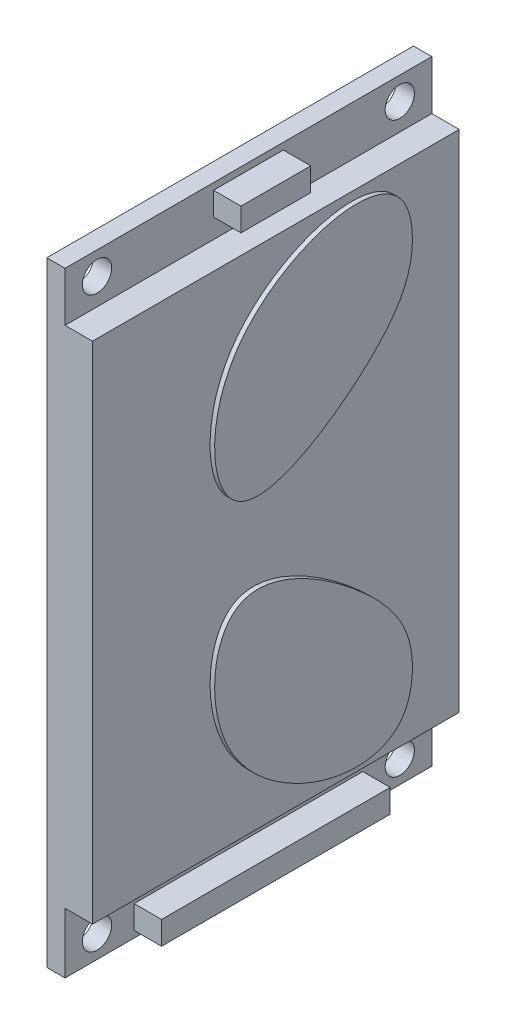
ISO-10303-21;
HEADER;
FILE_DESCRIPTION(('STEP AP214'),'2;1');
FILE_NAME('part.step','',(''),(''),'','','');
FILE_SCHEMA(('AUTOMOTIVE_DESIGN { 1 0 10303 214 1 1 1 1 }'));
ENDSEC;
DATA;
#1=APPLICATION_CONTEXT('core data for automotive mechanical design processes');
#2=APPLICATION_PROTOCOL_DEFINITION('international standard','automotive_design',2000,#1);
#3=PRODUCT_CONTEXT('',#1,'mechanical');
#4=PRODUCT('Part','Part','',(#3));
#5=PRODUCT_RELATED_PRODUCT_CATEGORY('part','',(#4));
#6=PRODUCT_DEFINITION_FORMATION('','',#4);
#7=PRODUCT_DEFINITION_CONTEXT('part definition',#1,'design');
#8=PRODUCT_DEFINITION('design','',#6,#7);
#9=PRODUCT_DEFINITION_SHAPE('','',#8);
#10=(LENGTH_UNIT() NAMED_UNIT(*) SI_UNIT(.MILLI.,.METRE.));
#11=(NAMED_UNIT(*) PLANE_ANGLE_UNIT() SI_UNIT($,.RADIAN.));
#12=(NAMED_UNIT(*) SI_UNIT($,.STERADIAN.) SOLID_ANGLE_UNIT());
#13=UNCERTAINTY_MEASURE_WITH_UNIT(LENGTH_MEASURE(1.E-05),#10,'distance_accuracy_value','');
#14=(GEOMETRIC_REPRESENTATION_CONTEXT(3) GLOBAL_UNCERTAINTY_ASSIGNED_CONTEXT((#13)) GLOBAL_UNIT_ASSIGNED_CONTEXT((#10,
#11,#12)) REPRESENTATION_CONTEXT('',''));
#15=CARTESIAN_POINT('',(0.,0.,0.));
#16=DIRECTION('',(0.,0.,1.));
#17=DIRECTION('',(1.,0.,0.));
#18=AXIS2_PLACEMENT_3D('',#15,#16,#17);
#19=CARTESIAN_POINT('',(5.,0.,0.));
#20=DIRECTION('',(1.,0.,0.));
#21=DIRECTION('',(0.,0.,-1.));
#22=AXIS2_PLACEMENT_3D('',#19,#20,#21);
#23=PLANE('',#22);
#24=CARTESIAN_POINT('',(5.,-10.2586471575167,-9.42816080804507));
#25=CARTESIAN_POINT('',(5.,-6.29072358338968,-5.12400212686618));
#26=CARTESIAN_POINT('',(5.,1.29246768812794,7.12818951407956));
#27=CARTESIAN_POINT('',(5.,-22.7986894668621,8.89477922719525));
#28=CARTESIAN_POINT('',(5.,-29.6711719479845,-13.4149737789119));
#29=CARTESIAN_POINT('',(5.,-16.6006162500444,-15.011746549894));
#30=CARTESIAN_POINT('',(5.,-12.7665080775932,-12.148533604719));
#31=CARTESIAN_POINT('',(5.,-10.2586471575167,-9.42816080804507));
#32=B_SPLINE_CURVE_WITH_KNOTS('',3,(#24,#25,#26,#27,#28,#29,#30,#31),.UNSPECIFIED.,.T.,.F.,(4,1,
1,1,1,4),(0.,0.241211959579483,0.458999961125512,0.766283654105539,0.847545942964001,1.),.UNSPECIFIED.);
#33=CARTESIAN_POINT('',(5.,-10.2586471575167,-9.42816080804507));
#34=VERTEX_POINT('',#33);
#35=EDGE_CURVE('E673',#34,#34,#32,.T.);
#36=ORIENTED_EDGE('',*,*,#35,.F.);
#37=EDGE_LOOP('',(#36));
#38=FACE_BOUND('',#37,.T.);
#39=DIRECTION('',(0.,-1.,0.));
#40=VECTOR('',#39,1.);
#41=CARTESIAN_POINT('',(5.,28.2,20.05));
#42=LINE('',#41,#40);
#43=CARTESIAN_POINT('',(5.,28.2,20.05));
#44=VERTEX_POINT('',#43);
#45=CARTESIAN_POINT('',(5.,-27.,20.05));
#46=VERTEX_POINT('',#45);
#47=EDGE_CURVE('E223',#44,#46,#42,.T.);
#48=ORIENTED_EDGE('',*,*,#47,.T.);
#49=DIRECTION('',(0.,0.,-1.));
#50=VECTOR('',#49,1.);
#51=CARTESIAN_POINT('',(5.,-27.,20.05));
#52=LINE('',#51,#50);
#53=CARTESIAN_POINT('',(5.,-27.,-20.05));
#54=VERTEX_POINT('',#53);
#55=EDGE_CURVE('E226',#46,#54,#52,.T.);
#56=ORIENTED_EDGE('',*,*,#55,.T.);
#57=DIRECTION('',(0.,1.,0.));
#58=VECTOR('',#57,1.);
#59=CARTESIAN_POINT('',(5.,28.2,-20.05));
#60=LINE('',#59,#58);
#61=CARTESIAN_POINT('',(5.,28.2,-20.05));
#62=VERTEX_POINT('',#61);
#63=EDGE_CURVE('E229',#54,#62,#60,.T.);
#64=ORIENTED_EDGE('',*,*,#63,.T.);
#65=DIRECTION('',(0.,0.,1.));
#66=VECTOR('',#65,1.);
#67=CARTESIAN_POINT('',(5.,28.2,20.05));
#68=LINE('',#67,#66);
#69=EDGE_CURVE('E231',#62,#44,#68,.T.);
#70=ORIENTED_EDGE('',*,*,#69,.T.);
#71=EDGE_LOOP('',(#48,#56,#64,#70));
#72=FACE_BOUND('',#71,.T.);
#73=CARTESIAN_POINT('',(5.,11.4586471575167,-9.42816080804507));
#74=CARTESIAN_POINT('',(5.,13.9665080775932,-12.148533604719));
#75=CARTESIAN_POINT('',(5.,17.8006162500443,-15.011746549894));
#76=CARTESIAN_POINT('',(5.,30.8711719479844,-13.4149737789119));
#77=CARTESIAN_POINT('',(5.,23.9986894668621,8.89477922719526));
#78=CARTESIAN_POINT('',(5.,-0.0924676881279725,7.12818951407956));
#79=CARTESIAN_POINT('',(5.,7.49072358338963,-5.12400212686618));
#80=CARTESIAN_POINT('',(5.,11.4586471575167,-9.42816080804507));
#81=B_SPLINE_CURVE_WITH_KNOTS('',3,(#73,#74,#75,#76,#77,#78,#79,#80),.UNSPECIFIED.,.T.,.F.,(4,1,
1,1,1,4),(0.,0.152454057035999,0.233716345894461,0.541000038874488,0.758788040420517,1.),.UNSPECIFIED.);
#82=CARTESIAN_POINT('',(5.,11.4586471575167,-9.42816080804507));
#83=VERTEX_POINT('',#82);
#84=EDGE_CURVE('E686',#83,#83,#81,.T.);
#85=ORIENTED_EDGE('',*,*,#84,.F.);
#86=EDGE_LOOP('',(#85));
#87=FACE_BOUND('',#86,.T.);
#88=ADVANCED_FACE('F45',(#38,#72,#87),#23,.T.);
#89=CARTESIAN_POINT('',(2.,0.,0.));
#90=DIRECTION('',(-1.,0.,0.));
#91=DIRECTION('',(0.,0.,1.));
#92=AXIS2_PLACEMENT_3D('',#89,#90,#91);
#93=PLANE('',#92);
#94=DIRECTION('',(0.,0.,1.));
#95=VECTOR('',#94,1.);
#96=CARTESIAN_POINT('',(2.,28.2,20.05));
#97=LINE('',#96,#95);
#98=CARTESIAN_POINT('',(2.,28.2,-20.05));
#99=VERTEX_POINT('',#98);
#100=CARTESIAN_POINT('',(2.,28.2,20.05));
#101=VERTEX_POINT('',#100);
#102=EDGE_CURVE('E227',#99,#101,#97,.T.);
#103=ORIENTED_EDGE('',*,*,#102,.F.);
#104=DIRECTION('',(0.,1.,0.));
#105=VECTOR('',#104,1.);
#106=CARTESIAN_POINT('',(2.,-33.6,-20.05));
#107=LINE('',#106,#105);
#108=CARTESIAN_POINT('',(2.,33.6,-20.05));
#109=VERTEX_POINT('',#108);
#110=EDGE_CURVE('E277',#99,#109,#107,.T.);
#111=ORIENTED_EDGE('',*,*,#110,.T.);
#112=DIRECTION('',(0.,0.,1.));
#113=VECTOR('',#112,1.);
#114=CARTESIAN_POINT('',(2.,33.6,20.05));
#115=LINE('',#114,#113);
#116=CARTESIAN_POINT('',(2.,33.6,20.05));
#117=VERTEX_POINT('',#116);
#118=EDGE_CURVE('E276',#109,#117,#115,.T.);
#119=ORIENTED_EDGE('',*,*,#118,.T.);
#120=DIRECTION('',(0.,-1.,0.));
#121=VECTOR('',#120,1.);
#122=CARTESIAN_POINT('',(2.,-33.6,20.05));
#123=LINE('',#122,#121);
#124=EDGE_CURVE('E280',#117,#101,#123,.T.);
#125=ORIENTED_EDGE('',*,*,#124,.T.);
#126=EDGE_LOOP('',(#103,#111,#119,#125));
#127=FACE_BOUND('',#126,.T.);
#128=CARTESIAN_POINT('',(2.,31.1,-16.55));
#129=DIRECTION('',(1.,0.,0.));
#130=DIRECTION('',(0.,0.,-1.));
#131=AXIS2_PLACEMENT_3D('',#128,#129,#130);
#132=CIRCLE('',#131,1.6);
#133=CARTESIAN_POINT('',(2.,31.1,-18.15));
#134=VERTEX_POINT('',#133);
#135=EDGE_CURVE('E268',#134,#134,#132,.T.);
#136=ORIENTED_EDGE('',*,*,#135,.F.);
#137=EDGE_LOOP('',(#136));
#138=FACE_BOUND('',#137,.T.);
#139=CARTESIAN_POINT('',(2.,31.1,16.55));
#140=DIRECTION('',(1.,0.,0.));
#141=DIRECTION('',(0.,0.,1.));
#142=AXIS2_PLACEMENT_3D('',#139,#140,#141);
#143=CIRCLE('',#142,1.6);
#144=CARTESIAN_POINT('',(2.,31.1,18.15));
#145=VERTEX_POINT('',#144);
#146=EDGE_CURVE('E250',#145,#145,#143,.T.);
#147=ORIENTED_EDGE('',*,*,#146,.F.);
#148=EDGE_LOOP('',(#147));
#149=FACE_BOUND('',#148,.T.);
#150=DIRECTION('',(0.,-1.,0.));
#151=VECTOR('',#150,1.);
#152=CARTESIAN_POINT('',(2.,32.87,3.81));
#153=LINE('',#152,#151);
#154=CARTESIAN_POINT('',(2.,32.87,3.81));
#155=VERTEX_POINT('',#154);
#156=CARTESIAN_POINT('',(2.,30.33,3.81));
#157=VERTEX_POINT('',#156);
#158=EDGE_CURVE('E154',#155,#157,#153,.T.);
#159=ORIENTED_EDGE('',*,*,#158,.F.);
#160=DIRECTION('',(0.,0.,1.));
#161=VECTOR('',#160,1.);
#162=CARTESIAN_POINT('',(2.,32.87,3.81));
#163=LINE('',#162,#161);
#164=CARTESIAN_POINT('',(2.,32.87,-3.81));
#165=VERTEX_POINT('',#164);
#166=EDGE_CURVE('E157',#165,#155,#163,.T.);
#167=ORIENTED_EDGE('',*,*,#166,.F.);
#168=DIRECTION('',(0.,1.,0.));
#169=VECTOR('',#168,1.);
#170=CARTESIAN_POINT('',(2.,32.87,-3.81));
#171=LINE('',#170,#169);
#172=CARTESIAN_POINT('',(2.,30.33,-3.81));
#173=VERTEX_POINT('',#172);
#174=EDGE_CURVE('E65',#173,#165,#171,.T.);
#175=ORIENTED_EDGE('',*,*,#174,.F.);
#176=DIRECTION('',(0.,0.,-1.));
#177=VECTOR('',#176,1.);
#178=CARTESIAN_POINT('',(2.,30.33,3.81));
#179=LINE('',#178,#177);
#180=EDGE_CURVE('E60',#157,#173,#179,.T.);
#181=ORIENTED_EDGE('',*,*,#180,.F.);
#182=EDGE_LOOP('',(#159,#167,#175,#181));
#183=FACE_BOUND('',#182,.T.);
#184=ADVANCED_FACE('F156',(#127,#138,#149,#183),#93,.F.);
#185=DIRECTION('',(0.,0.,-1.));
#186=VECTOR('',#185,1.);
#187=CARTESIAN_POINT('',(2.,-27.,20.05));
#188=LINE('',#187,#186);
#189=CARTESIAN_POINT('',(2.,-27.,20.05));
#190=VERTEX_POINT('',#189);
#191=CARTESIAN_POINT('',(2.,-27.,-20.05));
#192=VERTEX_POINT('',#191);
#193=EDGE_CURVE('E215',#190,#192,#188,.T.);
#194=ORIENTED_EDGE('',*,*,#193,.F.);
#195=CARTESIAN_POINT('',(2.,-33.6,20.05));
#196=VERTEX_POINT('',#195);
#197=EDGE_CURVE('E279',#190,#196,#123,.T.);
#198=ORIENTED_EDGE('',*,*,#197,.T.);
#199=DIRECTION('',(0.,0.,-1.));
#200=VECTOR('',#199,1.);
#201=CARTESIAN_POINT('',(2.,-33.6,20.05));
#202=LINE('',#201,#200);
#203=CARTESIAN_POINT('',(2.,-33.6,-20.05));
#204=VERTEX_POINT('',#203);
#205=EDGE_CURVE('E282',#196,#204,#202,.T.);
#206=ORIENTED_EDGE('',*,*,#205,.T.);
#207=EDGE_CURVE('E274',#204,#192,#107,.T.);
#208=ORIENTED_EDGE('',*,*,#207,.T.);
#209=EDGE_LOOP('',(#194,#198,#206,#208));
#210=FACE_BOUND('',#209,.T.);
#211=CARTESIAN_POINT('',(2.,-31.11,-16.55));
#212=DIRECTION('',(1.,0.,0.));
#213=DIRECTION('',(0.,0.,-1.));
#214=AXIS2_PLACEMENT_3D('',#211,#212,#213);
#215=CIRCLE('',#214,1.6);
#216=CARTESIAN_POINT('',(2.,-31.11,-18.15));
#217=VERTEX_POINT('',#216);
#218=EDGE_CURVE('E262',#217,#217,#215,.T.);
#219=ORIENTED_EDGE('',*,*,#218,.F.);
#220=EDGE_LOOP('',(#219));
#221=FACE_BOUND('',#220,.T.);
#222=CARTESIAN_POINT('',(2.,-31.11,16.55));
#223=DIRECTION('',(1.,0.,0.));
#224=DIRECTION('',(0.,0.,1.));
#225=AXIS2_PLACEMENT_3D('',#222,#223,#224);
#226=CIRCLE('',#225,1.6);
#227=CARTESIAN_POINT('',(2.,-31.11,18.15));
#228=VERTEX_POINT('',#227);
#229=EDGE_CURVE('E256',#228,#228,#226,.T.);
#230=ORIENTED_EDGE('',*,*,#229,.F.);
#231=EDGE_LOOP('',(#230));
#232=FACE_BOUND('',#231,.T.);
#233=DIRECTION('',(0.,-1.,0.));
#234=VECTOR('',#233,1.);
#235=CARTESIAN_POINT('',(2.,-30.33,12.5));
#236=LINE('',#235,#234);
#237=CARTESIAN_POINT('',(2.,-30.33,12.5));
#238=VERTEX_POINT('',#237);
#239=CARTESIAN_POINT('',(2.,-32.87,12.5));
#240=VERTEX_POINT('',#239);
#241=EDGE_CURVE('E212',#238,#240,#236,.T.);
#242=ORIENTED_EDGE('',*,*,#241,.F.);
#243=DIRECTION('',(0.,0.,1.));
#244=VECTOR('',#243,1.);
#245=CARTESIAN_POINT('',(2.,-30.33,12.5));
#246=LINE('',#245,#244);
#247=CARTESIAN_POINT('',(2.,-30.33,-12.5));
#248=VERTEX_POINT('',#247);
#249=EDGE_CURVE('E202',#248,#238,#246,.T.);
#250=ORIENTED_EDGE('',*,*,#249,.F.);
#251=DIRECTION('',(0.,1.,0.));
#252=VECTOR('',#251,1.);
#253=CARTESIAN_POINT('',(2.,-30.33,-12.5));
#254=LINE('',#253,#252);
#255=CARTESIAN_POINT('',(2.,-32.87,-12.5));
#256=VERTEX_POINT('',#255);
#257=EDGE_CURVE('E205',#256,#248,#254,.T.);
#258=ORIENTED_EDGE('',*,*,#257,.F.);
#259=DIRECTION('',(0.,0.,-1.));
#260=VECTOR('',#259,1.);
#261=CARTESIAN_POINT('',(2.,-32.87,12.5));
#262=LINE('',#261,#260);
#263=EDGE_CURVE('E209',#240,#256,#262,.T.);
#264=ORIENTED_EDGE('',*,*,#263,.F.);
#265=EDGE_LOOP('',(#242,#250,#258,#264));
#266=FACE_BOUND('',#265,.T.);
#267=ADVANCED_FACE('F321',(#210,#221,#232,#266),#93,.F.);
#268=CARTESIAN_POINT('',(0.,0.,0.));
#269=DIRECTION('',(-1.,0.,0.));
#270=DIRECTION('',(0.,0.,1.));
#271=AXIS2_PLACEMENT_3D('',#268,#269,#270);
#272=PLANE('',#271);
#273=CARTESIAN_POINT('',(0.,-31.11,16.55));
#274=DIRECTION('',(1.,0.,0.));
#275=DIRECTION('',(0.,0.,1.));
#276=AXIS2_PLACEMENT_3D('',#273,#274,#275);
#277=CIRCLE('',#276,1.6);
#278=CARTESIAN_POINT('',(0.,-31.11,18.15));
#279=VERTEX_POINT('',#278);
#280=EDGE_CURVE('E253',#279,#279,#277,.T.);
#281=ORIENTED_EDGE('',*,*,#280,.T.);
#282=EDGE_LOOP('',(#281));
#283=FACE_BOUND('',#282,.T.);
#284=CARTESIAN_POINT('',(0.,31.1,-16.55));
#285=DIRECTION('',(1.,0.,0.));
#286=DIRECTION('',(0.,0.,-1.));
#287=AXIS2_PLACEMENT_3D('',#284,#285,#286);
#288=CIRCLE('',#287,1.6);
#289=CARTESIAN_POINT('',(0.,31.1,-18.15));
#290=VERTEX_POINT('',#289);
#291=EDGE_CURVE('E265',#290,#290,#288,.T.);
#292=ORIENTED_EDGE('',*,*,#291,.T.);
#293=EDGE_LOOP('',(#292));
#294=FACE_BOUND('',#293,.T.);
#295=DIRECTION('',(0.,1.,0.));
#296=VECTOR('',#295,1.);
#297=CARTESIAN_POINT('',(0.,-33.6,-20.05));
#298=LINE('',#297,#296);
#299=CARTESIAN_POINT('',(0.,-33.6,-20.05));
#300=VERTEX_POINT('',#299);
#301=CARTESIAN_POINT('',(0.,33.6,-20.05));
#302=VERTEX_POINT('',#301);
#303=EDGE_CURVE('E271',#300,#302,#298,.T.);
#304=ORIENTED_EDGE('',*,*,#303,.F.);
#305=DIRECTION('',(0.,0.,-1.));
#306=VECTOR('',#305,1.);
#307=CARTESIAN_POINT('',(0.,-33.6,20.05));
#308=LINE('',#307,#306);
#309=CARTESIAN_POINT('',(0.,-33.6,20.05));
#310=VERTEX_POINT('',#309);
#311=EDGE_CURVE('E291',#310,#300,#308,.T.);
#312=ORIENTED_EDGE('',*,*,#311,.F.);
#313=DIRECTION('',(0.,-1.,0.));
#314=VECTOR('',#313,1.);
#315=CARTESIAN_POINT('',(0.,-33.6,20.05));
#316=LINE('',#315,#314);
#317=CARTESIAN_POINT('',(0.,33.6,20.05));
#318=VERTEX_POINT('',#317);
#319=EDGE_CURVE('E289',#318,#310,#316,.T.);
#320=ORIENTED_EDGE('',*,*,#319,.F.);
#321=DIRECTION('',(0.,0.,1.));
#322=VECTOR('',#321,1.);
#323=CARTESIAN_POINT('',(0.,33.6,20.05));
#324=LINE('',#323,#322);
#325=EDGE_CURVE('E287',#302,#318,#324,.T.);
#326=ORIENTED_EDGE('',*,*,#325,.F.);
#327=EDGE_LOOP('',(#304,#312,#320,#326));
#328=FACE_BOUND('',#327,.T.);
#329=CARTESIAN_POINT('',(0.,-31.11,-16.55));
#330=DIRECTION('',(1.,0.,0.));
#331=DIRECTION('',(0.,0.,-1.));
#332=AXIS2_PLACEMENT_3D('',#329,#330,#331);
#333=CIRCLE('',#332,1.6);
#334=CARTESIAN_POINT('',(0.,-31.11,-18.15));
#335=VERTEX_POINT('',#334);
#336=EDGE_CURVE('E259',#335,#335,#333,.T.);
#337=ORIENTED_EDGE('',*,*,#336,.T.);
#338=EDGE_LOOP('',(#337));
#339=FACE_BOUND('',#338,.T.);
#340=CARTESIAN_POINT('',(0.,31.1,16.55));
#341=DIRECTION('',(1.,0.,0.));
#342=DIRECTION('',(0.,0.,1.));
#343=AXIS2_PLACEMENT_3D('',#340,#341,#342);
#344=CIRCLE('',#343,1.6);
#345=CARTESIAN_POINT('',(0.,31.1,18.15));
#346=VERTEX_POINT('',#345);
#347=EDGE_CURVE('E249',#346,#346,#344,.T.);
#348=ORIENTED_EDGE('',*,*,#347,.T.);
#349=EDGE_LOOP('',(#348));
#350=FACE_BOUND('',#349,.T.);
#351=ADVANCED_FACE('F309',(#283,#294,#328,#339,#350),#272,.T.);
#352=CARTESIAN_POINT('',(2.,-33.6,-20.05));
#353=DIRECTION('',(0.,0.,1.));
#354=DIRECTION('',(1.,0.,0.));
#355=AXIS2_PLACEMENT_3D('',#352,#353,#354);
#356=PLANE('',#355);
#357=ORIENTED_EDGE('',*,*,#303,.T.);
#358=DIRECTION('',(-1.,0.,0.));
#359=VECTOR('',#358,1.);
#360=CARTESIAN_POINT('',(2.,33.6,-20.05));
#361=LINE('',#360,#359);
#362=EDGE_CURVE('E11',#109,#302,#361,.T.);
#363=ORIENTED_EDGE('',*,*,#362,.F.);
#364=ORIENTED_EDGE('',*,*,#110,.F.);
#365=DIRECTION('',(-1.,0.,0.));
#366=VECTOR('',#365,1.);
#367=CARTESIAN_POINT('',(5.,28.2,-20.05));
#368=LINE('',#367,#366);
#369=EDGE_CURVE('E240',#62,#99,#368,.T.);
#370=ORIENTED_EDGE('',*,*,#369,.F.);
#371=ORIENTED_EDGE('',*,*,#63,.F.);
#372=DIRECTION('',(-1.,0.,0.));
#373=VECTOR('',#372,1.);
#374=CARTESIAN_POINT('',(5.,-27.,-20.05));
#375=LINE('',#374,#373);
#376=EDGE_CURVE('E243',#54,#192,#375,.T.);
#377=ORIENTED_EDGE('',*,*,#376,.T.);
#378=ORIENTED_EDGE('',*,*,#207,.F.);
#379=DIRECTION('',(-1.,0.,0.));
#380=VECTOR('',#379,1.);
#381=CARTESIAN_POINT('',(2.,-33.6,-20.05));
#382=LINE('',#381,#380);
#383=EDGE_CURVE('E284',#204,#300,#382,.T.);
#384=ORIENTED_EDGE('',*,*,#383,.T.);
#385=EDGE_LOOP('',(#357,#363,#364,#370,#371,#377,#378,#384));
#386=FACE_BOUND('',#385,.T.);
#387=ADVANCED_FACE('F47',(#386),#356,.F.);
#388=CARTESIAN_POINT('',(2.,33.6,20.05));
#389=DIRECTION('',(0.,-1.,0.));
#390=DIRECTION('',(0.,0.,-1.));
#391=AXIS2_PLACEMENT_3D('',#388,#389,#390);
#392=PLANE('',#391);
#393=ORIENTED_EDGE('',*,*,#325,.T.);
#394=DIRECTION('',(-1.,0.,0.));
#395=VECTOR('',#394,1.);
#396=CARTESIAN_POINT('',(2.,33.6,20.05));
#397=LINE('',#396,#395);
#398=EDGE_CURVE('E53',#117,#318,#397,.T.);
#399=ORIENTED_EDGE('',*,*,#398,.F.);
#400=ORIENTED_EDGE('',*,*,#118,.F.);
#401=ORIENTED_EDGE('',*,*,#362,.T.);
#402=EDGE_LOOP('',(#393,#399,#400,#401));
#403=FACE_BOUND('',#402,.T.);
#404=ADVANCED_FACE('F338',(#403),#392,.F.);
#405=CARTESIAN_POINT('',(2.,-33.6,20.05));
#406=DIRECTION('',(0.,0.,-1.));
#407=DIRECTION('',(0.,1.,0.));
#408=AXIS2_PLACEMENT_3D('',#405,#406,#407);
#409=PLANE('',#408);
#410=ORIENTED_EDGE('',*,*,#319,.T.);
#411=DIRECTION('',(-1.,0.,0.));
#412=VECTOR('',#411,1.);
#413=CARTESIAN_POINT('',(2.,-33.6,20.05));
#414=LINE('',#413,#412);
#415=EDGE_CURVE('E295',#196,#310,#414,.T.);
#416=ORIENTED_EDGE('',*,*,#415,.F.);
#417=ORIENTED_EDGE('',*,*,#197,.F.);
#418=DIRECTION('',(-1.,0.,0.));
#419=VECTOR('',#418,1.);
#420=CARTESIAN_POINT('',(5.,-27.,20.05));
#421=LINE('',#420,#419);
#422=EDGE_CURVE('E246',#46,#190,#421,.T.);
#423=ORIENTED_EDGE('',*,*,#422,.F.);
#424=ORIENTED_EDGE('',*,*,#47,.F.);
#425=DIRECTION('',(-1.,0.,0.));
#426=VECTOR('',#425,1.);
#427=CARTESIAN_POINT('',(5.,28.2,20.05));
#428=LINE('',#427,#426);
#429=EDGE_CURVE('E233',#44,#101,#428,.T.);
#430=ORIENTED_EDGE('',*,*,#429,.T.);
#431=ORIENTED_EDGE('',*,*,#124,.F.);
#432=ORIENTED_EDGE('',*,*,#398,.T.);
#433=EDGE_LOOP('',(#410,#416,#417,#423,#424,#430,#431,#432));
#434=FACE_BOUND('',#433,.T.);
#435=ADVANCED_FACE('F302',(#434),#409,.F.);
#436=CARTESIAN_POINT('',(2.,-33.6,20.05));
#437=DIRECTION('',(0.,1.,0.));
#438=DIRECTION('',(0.,0.,1.));
#439=AXIS2_PLACEMENT_3D('',#436,#437,#438);
#440=PLANE('',#439);
#441=ORIENTED_EDGE('',*,*,#311,.T.);
#442=ORIENTED_EDGE('',*,*,#383,.F.);
#443=ORIENTED_EDGE('',*,*,#205,.F.);
#444=ORIENTED_EDGE('',*,*,#415,.T.);
#445=EDGE_LOOP('',(#441,#442,#443,#444));
#446=FACE_BOUND('',#445,.T.);
#447=ADVANCED_FACE('F313',(#446),#440,.F.);
#448=CARTESIAN_POINT('',(2.,31.1,-16.55));
#449=DIRECTION('',(-1.,0.,0.));
#450=DIRECTION('',(0.,0.,1.));
#451=AXIS2_PLACEMENT_3D('',#448,#449,#450);
#452=CYLINDRICAL_SURFACE('',#451,1.6);
#453=ORIENTED_EDGE('',*,*,#135,.T.);
#454=EDGE_LOOP('',(#453));
#455=FACE_BOUND('',#454,.T.);
#456=ORIENTED_EDGE('',*,*,#291,.F.);
#457=EDGE_LOOP('',(#456));
#458=FACE_BOUND('',#457,.T.);
#459=ADVANCED_FACE('F373',(#455,#458),#452,.F.);
#460=CARTESIAN_POINT('',(2.,-31.11,-16.55));
#461=DIRECTION('',(-1.,0.,0.));
#462=DIRECTION('',(0.,0.,1.));
#463=AXIS2_PLACEMENT_3D('',#460,#461,#462);
#464=CYLINDRICAL_SURFACE('',#463,1.6);
#465=ORIENTED_EDGE('',*,*,#218,.T.);
#466=EDGE_LOOP('',(#465));
#467=FACE_BOUND('',#466,.T.);
#468=ORIENTED_EDGE('',*,*,#336,.F.);
#469=EDGE_LOOP('',(#468));
#470=FACE_BOUND('',#469,.T.);
#471=ADVANCED_FACE('F369',(#467,#470),#464,.F.);
#472=CARTESIAN_POINT('',(2.,-31.11,16.55));
#473=DIRECTION('',(-1.,0.,0.));
#474=DIRECTION('',(0.,0.,1.));
#475=AXIS2_PLACEMENT_3D('',#472,#473,#474);
#476=CYLINDRICAL_SURFACE('',#475,1.6);
#477=ORIENTED_EDGE('',*,*,#229,.T.);
#478=EDGE_LOOP('',(#477));
#479=FACE_BOUND('',#478,.T.);
#480=ORIENTED_EDGE('',*,*,#280,.F.);
#481=EDGE_LOOP('',(#480));
#482=FACE_BOUND('',#481,.T.);
#483=ADVANCED_FACE('F365',(#479,#482),#476,.F.);
#484=CARTESIAN_POINT('',(2.,31.1,16.55));
#485=DIRECTION('',(-1.,0.,0.));
#486=DIRECTION('',(0.,0.,1.));
#487=AXIS2_PLACEMENT_3D('',#484,#485,#486);
#488=CYLINDRICAL_SURFACE('',#487,1.6);
#489=ORIENTED_EDGE('',*,*,#146,.T.);
#490=EDGE_LOOP('',(#489));
#491=FACE_BOUND('',#490,.T.);
#492=ORIENTED_EDGE('',*,*,#347,.F.);
#493=EDGE_LOOP('',(#492));
#494=FACE_BOUND('',#493,.T.);
#495=ADVANCED_FACE('F362',(#491,#494),#488,.F.);
#496=CARTESIAN_POINT('',(5.,-27.,20.05));
#497=DIRECTION('',(0.,1.,0.));
#498=DIRECTION('',(0.,0.,1.));
#499=AXIS2_PLACEMENT_3D('',#496,#497,#498);
#500=PLANE('',#499);
#501=ORIENTED_EDGE('',*,*,#193,.T.);
#502=ORIENTED_EDGE('',*,*,#376,.F.);
#503=ORIENTED_EDGE('',*,*,#55,.F.);
#504=ORIENTED_EDGE('',*,*,#422,.T.);
#505=EDGE_LOOP('',(#501,#502,#503,#504));
#506=FACE_BOUND('',#505,.T.);
#507=ADVANCED_FACE('F325',(#506),#500,.F.);
#508=CARTESIAN_POINT('',(5.,28.2,20.05));
#509=DIRECTION('',(0.,-1.,0.));
#510=DIRECTION('',(0.,0.,-1.));
#511=AXIS2_PLACEMENT_3D('',#508,#509,#510);
#512=PLANE('',#511);
#513=ORIENTED_EDGE('',*,*,#102,.T.);
#514=ORIENTED_EDGE('',*,*,#429,.F.);
#515=ORIENTED_EDGE('',*,*,#69,.F.);
#516=ORIENTED_EDGE('',*,*,#369,.T.);
#517=EDGE_LOOP('',(#513,#514,#515,#516));
#518=FACE_BOUND('',#517,.T.);
#519=ADVANCED_FACE('F334',(#518),#512,.F.);
#520=CARTESIAN_POINT('',(5.,-30.33,12.5));
#521=DIRECTION('',(0.,0.,-1.));
#522=DIRECTION('',(-1.,0.,0.));
#523=AXIS2_PLACEMENT_3D('',#520,#521,#522);
#524=PLANE('',#523);
#525=ORIENTED_EDGE('',*,*,#241,.T.);
#526=DIRECTION('',(-1.,0.,0.));
#527=VECTOR('',#526,1.);
#528=CARTESIAN_POINT('',(5.,-32.87,12.5));
#529=LINE('',#528,#527);
#530=CARTESIAN_POINT('',(5.,-32.87,12.5));
#531=VERTEX_POINT('',#530);
#532=EDGE_CURVE('E161',#531,#240,#529,.T.);
#533=ORIENTED_EDGE('',*,*,#532,.F.);
#534=DIRECTION('',(0.,-1.,0.));
#535=VECTOR('',#534,1.);
#536=CARTESIAN_POINT('',(5.,-30.33,12.5));
#537=LINE('',#536,#535);
#538=CARTESIAN_POINT('',(5.,-30.33,12.5));
#539=VERTEX_POINT('',#538);
#540=EDGE_CURVE('E206',#539,#531,#537,.T.);
#541=ORIENTED_EDGE('',*,*,#540,.F.);
#542=DIRECTION('',(-1.,0.,0.));
#543=VECTOR('',#542,1.);
#544=CARTESIAN_POINT('',(5.,-30.33,12.5));
#545=LINE('',#544,#543);
#546=EDGE_CURVE('E198',#539,#238,#545,.T.);
#547=ORIENTED_EDGE('',*,*,#546,.T.);
#548=EDGE_LOOP('',(#525,#533,#541,#547));
#549=FACE_BOUND('',#548,.T.);
#550=ADVANCED_FACE('F359',(#549),#524,.F.);
#551=CARTESIAN_POINT('',(5.,-32.87,12.5));
#552=DIRECTION('',(0.,1.,0.));
#553=DIRECTION('',(0.,0.,1.));
#554=AXIS2_PLACEMENT_3D('',#551,#552,#553);
#555=PLANE('',#554);
#556=ORIENTED_EDGE('',*,*,#263,.T.);
#557=DIRECTION('',(-1.,0.,0.));
#558=VECTOR('',#557,1.);
#559=CARTESIAN_POINT('',(5.,-32.87,-12.5));
#560=LINE('',#559,#558);
#561=CARTESIAN_POINT('',(5.,-32.87,-12.5));
#562=VERTEX_POINT('',#561);
#563=EDGE_CURVE('E192',#562,#256,#560,.T.);
#564=ORIENTED_EDGE('',*,*,#563,.F.);
#565=DIRECTION('',(0.,0.,-1.));
#566=VECTOR('',#565,1.);
#567=CARTESIAN_POINT('',(5.,-32.87,12.5));
#568=LINE('',#567,#566);
#569=EDGE_CURVE('E219',#531,#562,#568,.T.);
#570=ORIENTED_EDGE('',*,*,#569,.F.);
#571=ORIENTED_EDGE('',*,*,#532,.T.);
#572=EDGE_LOOP('',(#556,#564,#570,#571));
#573=FACE_BOUND('',#572,.T.);
#574=ADVANCED_FACE('F557',(#573),#555,.F.);
#575=CARTESIAN_POINT('',(5.,-30.33,-12.5));
#576=DIRECTION('',(0.,0.,1.));
#577=DIRECTION('',(1.,0.,0.));
#578=AXIS2_PLACEMENT_3D('',#575,#576,#577);
#579=PLANE('',#578);
#580=ORIENTED_EDGE('',*,*,#257,.T.);
#581=DIRECTION('',(-1.,0.,0.));
#582=VECTOR('',#581,1.);
#583=CARTESIAN_POINT('',(5.,-30.33,-12.5));
#584=LINE('',#583,#582);
#585=CARTESIAN_POINT('',(5.,-30.33,-12.5));
#586=VERTEX_POINT('',#585);
#587=EDGE_CURVE('E195',#586,#248,#584,.T.);
#588=ORIENTED_EDGE('',*,*,#587,.F.);
#589=DIRECTION('',(0.,1.,0.));
#590=VECTOR('',#589,1.);
#591=CARTESIAN_POINT('',(5.,-30.33,-12.5));
#592=LINE('',#591,#590);
#593=EDGE_CURVE('E217',#562,#586,#592,.T.);
#594=ORIENTED_EDGE('',*,*,#593,.F.);
#595=ORIENTED_EDGE('',*,*,#563,.T.);
#596=EDGE_LOOP('',(#580,#588,#594,#595));
#597=FACE_BOUND('',#596,.T.);
#598=ADVANCED_FACE('F566',(#597),#579,.F.);
#599=CARTESIAN_POINT('',(5.,-30.33,12.5));
#600=DIRECTION('',(0.,-1.,0.));
#601=DIRECTION('',(0.,0.,-1.));
#602=AXIS2_PLACEMENT_3D('',#599,#600,#601);
#603=PLANE('',#602);
#604=ORIENTED_EDGE('',*,*,#249,.T.);
#605=ORIENTED_EDGE('',*,*,#546,.F.);
#606=DIRECTION('',(0.,0.,1.));
#607=VECTOR('',#606,1.);
#608=CARTESIAN_POINT('',(5.,-30.33,12.5));
#609=LINE('',#608,#607);
#610=EDGE_CURVE('E201',#586,#539,#609,.T.);
#611=ORIENTED_EDGE('',*,*,#610,.F.);
#612=ORIENTED_EDGE('',*,*,#587,.T.);
#613=EDGE_LOOP('',(#604,#605,#611,#612));
#614=FACE_BOUND('',#613,.T.);
#615=ADVANCED_FACE('F575',(#614),#603,.F.);
#616=CARTESIAN_POINT('',(5.,0.,0.));
#617=DIRECTION('',(1.,0.,0.));
#618=DIRECTION('',(0.,0.,-1.));
#619=AXIS2_PLACEMENT_3D('',#616,#617,#618);
#620=PLANE('',#619);
#621=ORIENTED_EDGE('',*,*,#540,.T.);
#622=ORIENTED_EDGE('',*,*,#569,.T.);
#623=ORIENTED_EDGE('',*,*,#593,.T.);
#624=ORIENTED_EDGE('',*,*,#610,.T.);
#625=EDGE_LOOP('',(#621,#622,#623,#624));
#626=FACE_BOUND('',#625,.T.);
#627=ADVANCED_FACE('F355',(#626),#620,.T.);
#628=CARTESIAN_POINT('',(5.,32.87,3.81));
#629=DIRECTION('',(0.,0.,-1.));
#630=DIRECTION('',(-1.,0.,0.));
#631=AXIS2_PLACEMENT_3D('',#628,#629,#630);
#632=PLANE('',#631);
#633=ORIENTED_EDGE('',*,*,#158,.T.);
#634=DIRECTION('',(-1.,0.,0.));
#635=VECTOR('',#634,1.);
#636=CARTESIAN_POINT('',(5.,30.33,3.81));
#637=LINE('',#636,#635);
#638=CARTESIAN_POINT('',(5.,30.33,3.81));
#639=VERTEX_POINT('',#638);
#640=EDGE_CURVE('E672',#639,#157,#637,.T.);
#641=ORIENTED_EDGE('',*,*,#640,.F.);
#642=DIRECTION('',(0.,-1.,0.));
#643=VECTOR('',#642,1.);
#644=CARTESIAN_POINT('',(5.,32.87,3.81));
#645=LINE('',#644,#643);
#646=CARTESIAN_POINT('',(5.,32.87,3.81));
#647=VERTEX_POINT('',#646);
#648=EDGE_CURVE('E172',#647,#639,#645,.T.);
#649=ORIENTED_EDGE('',*,*,#648,.F.);
#650=DIRECTION('',(-1.,0.,0.));
#651=VECTOR('',#650,1.);
#652=CARTESIAN_POINT('',(5.,32.87,3.81));
#653=LINE('',#652,#651);
#654=EDGE_CURVE('E168',#647,#155,#653,.T.);
#655=ORIENTED_EDGE('',*,*,#654,.T.);
#656=EDGE_LOOP('',(#633,#641,#649,#655));
#657=FACE_BOUND('',#656,.T.);
#658=ADVANCED_FACE('F174',(#657),#632,.F.);
#659=CARTESIAN_POINT('',(5.,30.33,3.81));
#660=DIRECTION('',(0.,1.,0.));
#661=DIRECTION('',(0.,0.,1.));
#662=AXIS2_PLACEMENT_3D('',#659,#660,#661);
#663=PLANE('',#662);
#664=ORIENTED_EDGE('',*,*,#180,.T.);
#665=DIRECTION('',(-1.,0.,0.));
#666=VECTOR('',#665,1.);
#667=CARTESIAN_POINT('',(5.,30.33,-3.81));
#668=LINE('',#667,#666);
#669=CARTESIAN_POINT('',(5.,30.33,-3.81));
#670=VERTEX_POINT('',#669);
#671=EDGE_CURVE('E180',#670,#173,#668,.T.);
#672=ORIENTED_EDGE('',*,*,#671,.F.);
#673=DIRECTION('',(0.,0.,-1.));
#674=VECTOR('',#673,1.);
#675=CARTESIAN_POINT('',(5.,30.33,3.81));
#676=LINE('',#675,#674);
#677=EDGE_CURVE('E187',#639,#670,#676,.T.);
#678=ORIENTED_EDGE('',*,*,#677,.F.);
#679=ORIENTED_EDGE('',*,*,#640,.T.);
#680=EDGE_LOOP('',(#664,#672,#678,#679));
#681=FACE_BOUND('',#680,.T.);
#682=ADVANCED_FACE('F598',(#681),#663,.F.);
#683=CARTESIAN_POINT('',(5.,32.87,-3.81));
#684=DIRECTION('',(0.,0.,1.));
#685=DIRECTION('',(0.,-1.,0.));
#686=AXIS2_PLACEMENT_3D('',#683,#684,#685);
#687=PLANE('',#686);
#688=ORIENTED_EDGE('',*,*,#174,.T.);
#689=DIRECTION('',(-1.,0.,0.));
#690=VECTOR('',#689,1.);
#691=CARTESIAN_POINT('',(5.,32.87,-3.81));
#692=LINE('',#691,#690);
#693=CARTESIAN_POINT('',(5.,32.87,-3.81));
#694=VERTEX_POINT('',#693);
#695=EDGE_CURVE('E171',#694,#165,#692,.T.);
#696=ORIENTED_EDGE('',*,*,#695,.F.);
#697=DIRECTION('',(0.,1.,0.));
#698=VECTOR('',#697,1.);
#699=CARTESIAN_POINT('',(5.,32.87,-3.81));
#700=LINE('',#699,#698);
#701=EDGE_CURVE('E178',#670,#694,#700,.T.);
#702=ORIENTED_EDGE('',*,*,#701,.F.);
#703=ORIENTED_EDGE('',*,*,#671,.T.);
#704=EDGE_LOOP('',(#688,#696,#702,#703));
#705=FACE_BOUND('',#704,.T.);
#706=ADVANCED_FACE('F606',(#705),#687,.F.);
#707=CARTESIAN_POINT('',(5.,32.87,3.81));
#708=DIRECTION('',(0.,-1.,0.));
#709=DIRECTION('',(0.,0.,-1.));
#710=AXIS2_PLACEMENT_3D('',#707,#708,#709);
#711=PLANE('',#710);
#712=ORIENTED_EDGE('',*,*,#166,.T.);
#713=ORIENTED_EDGE('',*,*,#654,.F.);
#714=DIRECTION('',(0.,0.,1.));
#715=VECTOR('',#714,1.);
#716=CARTESIAN_POINT('',(5.,32.87,3.81));
#717=LINE('',#716,#715);
#718=EDGE_CURVE('E176',#694,#647,#717,.T.);
#719=ORIENTED_EDGE('',*,*,#718,.F.);
#720=ORIENTED_EDGE('',*,*,#695,.T.);
#721=EDGE_LOOP('',(#712,#713,#719,#720));
#722=FACE_BOUND('',#721,.T.);
#723=ADVANCED_FACE('F166',(#722),#711,.F.);
#724=CARTESIAN_POINT('',(5.,0.,0.));
#725=DIRECTION('',(1.,0.,0.));
#726=DIRECTION('',(0.,0.,-1.));
#727=AXIS2_PLACEMENT_3D('',#724,#725,#726);
#728=PLANE('',#727);
#729=ORIENTED_EDGE('',*,*,#648,.T.);
#730=ORIENTED_EDGE('',*,*,#677,.T.);
#731=ORIENTED_EDGE('',*,*,#701,.T.);
#732=ORIENTED_EDGE('',*,*,#718,.T.);
#733=EDGE_LOOP('',(#729,#730,#731,#732));
#734=FACE_BOUND('',#733,.T.);
#735=ADVANCED_FACE('F394',(#734),#728,.T.);
#736=CARTESIAN_POINT('',(5.5,-10.2586471575167,-9.42816080804507));
#737=CARTESIAN_POINT('',(5.5,-6.29072358338968,-5.12400212686618));
#738=CARTESIAN_POINT('',(5.5,1.29246768812794,7.12818951407956));
#739=CARTESIAN_POINT('',(5.5,-22.7986894668621,8.89477922719525));
#740=CARTESIAN_POINT('',(5.5,-29.6711719479845,-13.4149737789119));
#741=CARTESIAN_POINT('',(5.5,-16.6006162500444,-15.011746549894));
#742=CARTESIAN_POINT('',(5.5,-12.7665080775932,-12.148533604719));
#743=CARTESIAN_POINT('',(5.5,-10.2586471575167,-9.42816080804507));
#744=B_SPLINE_CURVE_WITH_KNOTS('',3,(#736,#737,#738,#739,#740,#741,#742,#743),.UNSPECIFIED.,.T.,
.F.,(4,1,1,1,1,4),(0.,0.241211959579483,0.458999961125512,0.766283654105539,0.847545942964001,
1.),.UNSPECIFIED.);
#745=DIRECTION('',(-1.,0.,0.));
#746=VECTOR('',#745,1.);
#747=SURFACE_OF_LINEAR_EXTRUSION('',#744,#746);
#748=CARTESIAN_POINT('',(5.5,-10.2586471575167,-9.42816080804507));
#749=VERTEX_POINT('',#748);
#750=EDGE_CURVE('E665',#749,#749,#744,.T.);
#751=ORIENTED_EDGE('',*,*,#750,.F.);
#752=EDGE_LOOP('',(#751));
#753=FACE_BOUND('',#752,.T.);
#754=ORIENTED_EDGE('',*,*,#35,.T.);
#755=EDGE_LOOP('',(#754));
#756=FACE_BOUND('',#755,.T.);
#757=ADVANCED_FACE('F390',(#753,#756),#747,.F.);
#758=CARTESIAN_POINT('',(5.5,-20.8052471325915,3.10590600757955));
#759=DIRECTION('',(1.,0.,0.));
#760=DIRECTION('',(0.,0.,-1.));
#761=AXIS2_PLACEMENT_3D('',#758,#759,#760);
#762=PLANE('',#761);
#763=ORIENTED_EDGE('',*,*,#750,.T.);
#764=EDGE_LOOP('',(#763));
#765=FACE_BOUND('',#764,.T.);
#766=ADVANCED_FACE('F393',(#765),#762,.T.);
#767=CARTESIAN_POINT('',(5.5,11.4586471575167,-9.42816080804507));
#768=CARTESIAN_POINT('',(5.5,13.9665080775932,-12.148533604719));
#769=CARTESIAN_POINT('',(5.5,17.8006162500443,-15.011746549894));
#770=CARTESIAN_POINT('',(5.5,30.8711719479844,-13.4149737789119));
#771=CARTESIAN_POINT('',(5.5,23.9986894668621,8.89477922719526));
#772=CARTESIAN_POINT('',(5.5,-0.0924676881279725,7.12818951407956));
#773=CARTESIAN_POINT('',(5.5,7.49072358338963,-5.12400212686618));
#774=CARTESIAN_POINT('',(5.5,11.4586471575167,-9.42816080804507));
#775=B_SPLINE_CURVE_WITH_KNOTS('',3,(#767,#768,#769,#770,#771,#772,#773,#774),.UNSPECIFIED.,.T.,
.F.,(4,1,1,1,1,4),(0.,0.152454057035999,0.233716345894461,0.541000038874488,0.758788040420517,
1.),.UNSPECIFIED.);
#776=DIRECTION('',(-1.,0.,0.));
#777=VECTOR('',#776,1.);
#778=SURFACE_OF_LINEAR_EXTRUSION('',#775,#777);
#779=CARTESIAN_POINT('',(5.5,11.4586471575167,-9.42816080804507));
#780=VERTEX_POINT('',#779);
#781=EDGE_CURVE('E674',#780,#780,#775,.T.);
#782=ORIENTED_EDGE('',*,*,#781,.F.);
#783=EDGE_LOOP('',(#782));
#784=FACE_BOUND('',#783,.T.);
#785=ORIENTED_EDGE('',*,*,#84,.T.);
#786=EDGE_LOOP('',(#785));
#787=FACE_BOUND('',#786,.T.);
#788=ADVANCED_FACE('F402',(#784,#787),#778,.F.);
#789=CARTESIAN_POINT('',(5.5,22.0052471325915,3.10590600757956));
#790=DIRECTION('',(-1.,0.,0.));
#791=DIRECTION('',(0.,0.,1.));
#792=AXIS2_PLACEMENT_3D('',#789,#790,#791);
#793=PLANE('',#792);
#794=ORIENTED_EDGE('',*,*,#781,.T.);
#795=EDGE_LOOP('',(#794));
#796=FACE_BOUND('',#795,.T.);
#797=ADVANCED_FACE('F410',(#796),#793,.F.);
#798=CLOSED_SHELL('',(#88,#184,#267,#351,#387,#404,#435,#447,#459,#471,#483,#495,#507,#519,#550,
#574,#598,#615,#627,#658,#682,#706,#723,#735,#757,#766,#788,#797));
#799=MANIFOLD_SOLID_BREP('B2',#798);
#800=ADVANCED_BREP_SHAPE_REPRESENTATION('',(#18,#799),#14);
#801=SHAPE_DEFINITION_REPRESENTATION(#9,#800);
ENDSEC;
END-ISO-10303-21;
